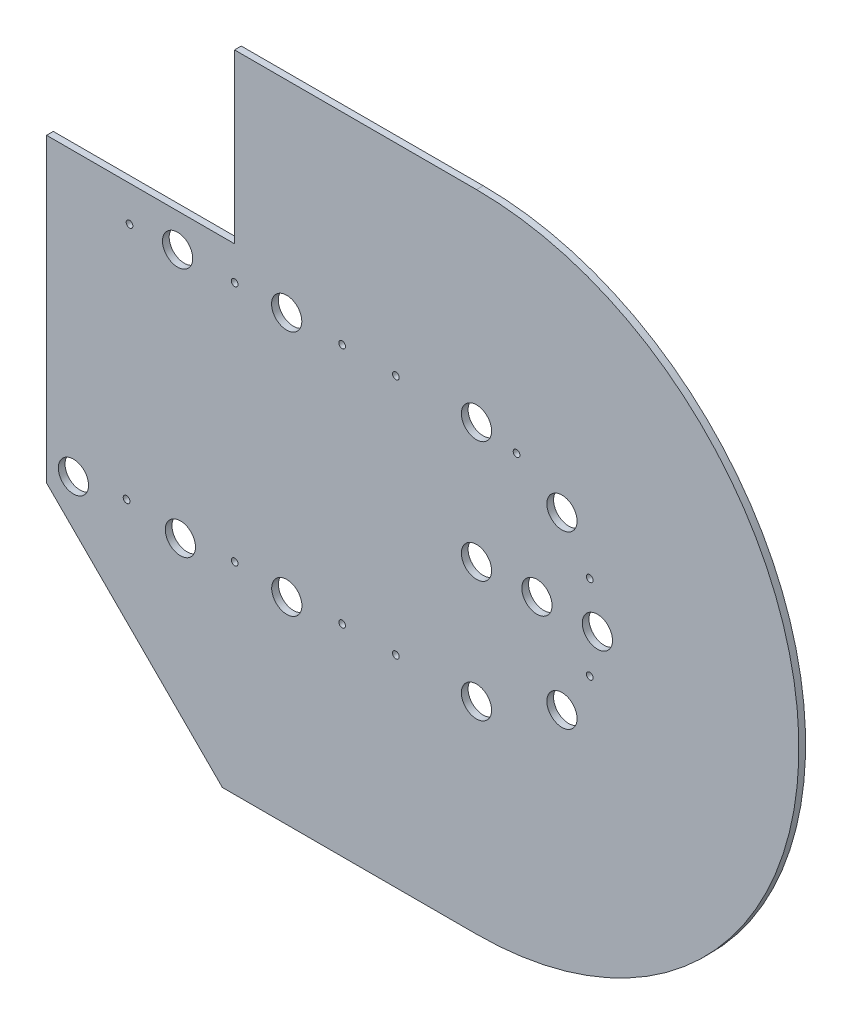
ISO-10303-21;
HEADER;
FILE_DESCRIPTION(('STEP AP214'),'2;1');
FILE_NAME('part.step','',(''),(''),'','','');
FILE_SCHEMA(('AUTOMOTIVE_DESIGN { 1 0 10303 214 1 1 1 1 }'));
ENDSEC;
DATA;
#1=APPLICATION_CONTEXT('core data for automotive mechanical design processes');
#2=APPLICATION_PROTOCOL_DEFINITION('international standard','automotive_design',2000,#1);
#3=PRODUCT_CONTEXT('',#1,'mechanical');
#4=PRODUCT('Part','Part','',(#3));
#5=PRODUCT_RELATED_PRODUCT_CATEGORY('part','',(#4));
#6=PRODUCT_DEFINITION_FORMATION('','',#4);
#7=PRODUCT_DEFINITION_CONTEXT('part definition',#1,'design');
#8=PRODUCT_DEFINITION('design','',#6,#7);
#9=PRODUCT_DEFINITION_SHAPE('','',#8);
#10=(LENGTH_UNIT() NAMED_UNIT(*) SI_UNIT(.MILLI.,.METRE.));
#11=(NAMED_UNIT(*) PLANE_ANGLE_UNIT() SI_UNIT($,.RADIAN.));
#12=(NAMED_UNIT(*) SI_UNIT($,.STERADIAN.) SOLID_ANGLE_UNIT());
#13=UNCERTAINTY_MEASURE_WITH_UNIT(LENGTH_MEASURE(1.E-05),#10,'distance_accuracy_value','');
#14=(GEOMETRIC_REPRESENTATION_CONTEXT(3) GLOBAL_UNCERTAINTY_ASSIGNED_CONTEXT((#13)) GLOBAL_UNIT_ASSIGNED_CONTEXT((#10,
#11,#12)) REPRESENTATION_CONTEXT('',''));
#15=CARTESIAN_POINT('',(0.,0.,0.));
#16=DIRECTION('',(0.,0.,1.));
#17=DIRECTION('',(1.,0.,0.));
#18=AXIS2_PLACEMENT_3D('',#15,#16,#17);
#19=CARTESIAN_POINT('',(0.,0.,6.35));
#20=DIRECTION('',(0.,0.,1.));
#21=DIRECTION('',(1.,0.,0.));
#22=AXIS2_PLACEMENT_3D('',#19,#20,#21);
#23=PLANE('',#22);
#24=DIRECTION('',(0.,1.,0.));
#25=VECTOR('',#24,1.);
#26=CARTESIAN_POINT('',(-228.717773435976,304.8,6.35));
#27=LINE('',#26,#25);
#28=CARTESIAN_POINT('',(-228.717773435976,146.05,6.35));
#29=VERTEX_POINT('',#28);
#30=CARTESIAN_POINT('',(-228.717773435976,304.8,6.35));
#31=VERTEX_POINT('',#30);
#32=EDGE_CURVE('E130',#29,#31,#27,.T.);
#33=ORIENTED_EDGE('',*,*,#32,.F.);
#34=DIRECTION('',(1.,0.,0.));
#35=VECTOR('',#34,1.);
#36=CARTESIAN_POINT('',(-406.4,146.05,6.35));
#37=LINE('',#36,#35);
#38=CARTESIAN_POINT('',(-406.4,146.05,6.35));
#39=VERTEX_POINT('',#38);
#40=EDGE_CURVE('E110',#39,#29,#37,.T.);
#41=ORIENTED_EDGE('',*,*,#40,.F.);
#42=DIRECTION('',(0.,-1.,0.));
#43=VECTOR('',#42,1.);
#44=CARTESIAN_POINT('',(-406.4,-120.65,6.35));
#45=LINE('',#44,#43);
#46=CARTESIAN_POINT('',(-406.4,-138.610512242138,6.35));
#47=VERTEX_POINT('',#46);
#48=EDGE_CURVE('E331',#39,#47,#45,.T.);
#49=ORIENTED_EDGE('',*,*,#48,.T.);
#50=DIRECTION('',(0.707106781186548,-0.707106781186547,0.));
#51=VECTOR('',#50,1.);
#52=CARTESIAN_POINT('',(-406.4,-138.610512242138,6.35));
#53=LINE('',#52,#51);
#54=CARTESIAN_POINT('',(-240.210512242138,-304.8,6.35));
#55=VERTEX_POINT('',#54);
#56=EDGE_CURVE('E334',#47,#55,#53,.T.);
#57=ORIENTED_EDGE('',*,*,#56,.T.);
#58=DIRECTION('',(1.,0.,0.));
#59=VECTOR('',#58,1.);
#60=CARTESIAN_POINT('',(-240.210512242138,-304.8,6.35));
#61=LINE('',#60,#59);
#62=CARTESIAN_POINT('',(0.,-304.8,6.35));
#63=VERTEX_POINT('',#62);
#64=EDGE_CURVE('E64',#55,#63,#61,.T.);
#65=ORIENTED_EDGE('',*,*,#64,.T.);
#66=CARTESIAN_POINT('',(0.,0.,6.35));
#67=DIRECTION('',(0.,0.,1.));
#68=DIRECTION('',(1.,0.,0.));
#69=AXIS2_PLACEMENT_3D('',#66,#67,#68);
#70=CIRCLE('',#69,304.8);
#71=CARTESIAN_POINT('',(0.,304.8,6.35));
#72=VERTEX_POINT('',#71);
#73=EDGE_CURVE('E326',#63,#72,#70,.T.);
#74=ORIENTED_EDGE('',*,*,#73,.T.);
#75=DIRECTION('',(-1.,0.,0.));
#76=VECTOR('',#75,1.);
#77=CARTESIAN_POINT('',(0.,304.8,6.35));
#78=LINE('',#77,#76);
#79=EDGE_CURVE('E91',#72,#31,#78,.T.);
#80=ORIENTED_EDGE('',*,*,#79,.T.);
#81=EDGE_LOOP('',(#33,#41,#49,#57,#65,#74,#80));
#82=FACE_BOUND('',#81,.T.);
#83=CARTESIAN_POINT('',(-127.,-114.3,6.35));
#84=DIRECTION('',(0.,0.,1.));
#85=DIRECTION('',(1.,0.,0.));
#86=AXIS2_PLACEMENT_3D('',#83,#84,#85);
#87=CIRCLE('',#86,3.175);
#88=CARTESIAN_POINT('',(-123.825,-114.3,6.35));
#89=VERTEX_POINT('',#88);
#90=EDGE_CURVE('E150',#89,#89,#87,.T.);
#91=ORIENTED_EDGE('',*,*,#90,.F.);
#92=EDGE_LOOP('',(#91));
#93=FACE_BOUND('',#92,.T.);
#94=CARTESIAN_POINT('',(-76.2,114.3,6.35));
#95=DIRECTION('',(0.,0.,1.));
#96=DIRECTION('',(1.,0.,0.));
#97=AXIS2_PLACEMENT_3D('',#94,#95,#96);
#98=CIRCLE('',#97,3.175);
#99=CARTESIAN_POINT('',(-73.025,114.3,6.35));
#100=VERTEX_POINT('',#99);
#101=EDGE_CURVE('E166',#100,#100,#98,.T.);
#102=ORIENTED_EDGE('',*,*,#101,.F.);
#103=EDGE_LOOP('',(#102));
#104=FACE_BOUND('',#103,.T.);
#105=CARTESIAN_POINT('',(-228.6,114.3,6.35));
#106=DIRECTION('',(0.,0.,1.));
#107=DIRECTION('',(1.,0.,0.));
#108=AXIS2_PLACEMENT_3D('',#105,#106,#107);
#109=CIRCLE('',#108,3.17500000000001);
#110=CARTESIAN_POINT('',(-225.425,114.3,6.35));
#111=VERTEX_POINT('',#110);
#112=EDGE_CURVE('E182',#111,#111,#109,.T.);
#113=ORIENTED_EDGE('',*,*,#112,.F.);
#114=EDGE_LOOP('',(#113));
#115=FACE_BOUND('',#114,.T.);
#116=CARTESIAN_POINT('',(-327.981609649123,112.531845238095,6.35));
#117=DIRECTION('',(0.,0.,1.));
#118=DIRECTION('',(1.,0.,0.));
#119=AXIS2_PLACEMENT_3D('',#116,#117,#118);
#120=CIRCLE('',#119,3.17499999999998);
#121=CARTESIAN_POINT('',(-324.806609649123,112.531845238095,6.35));
#122=VERTEX_POINT('',#121);
#123=EDGE_CURVE('E198',#122,#122,#120,.T.);
#124=ORIENTED_EDGE('',*,*,#123,.F.);
#125=EDGE_LOOP('',(#124));
#126=FACE_BOUND('',#125,.T.);
#127=CARTESIAN_POINT('',(107.090214294279,39.9521714354231,6.35));
#128=DIRECTION('',(0.,0.,1.));
#129=DIRECTION('',(1.,0.,0.));
#130=AXIS2_PLACEMENT_3D('',#127,#128,#129);
#131=CIRCLE('',#130,3.175);
#132=CARTESIAN_POINT('',(110.265214294279,39.9521714354231,6.35));
#133=VERTEX_POINT('',#132);
#134=EDGE_CURVE('E214',#133,#133,#131,.T.);
#135=ORIENTED_EDGE('',*,*,#134,.F.);
#136=EDGE_LOOP('',(#135));
#137=FACE_BOUND('',#136,.T.);
#138=CARTESIAN_POINT('',(57.15,0.,6.35));
#139=DIRECTION('',(0.,0.,1.));
#140=DIRECTION('',(1.,0.,0.));
#141=AXIS2_PLACEMENT_3D('',#138,#139,#140);
#142=CIRCLE('',#141,14.2875);
#143=CARTESIAN_POINT('',(71.4375,0.,6.35));
#144=VERTEX_POINT('',#143);
#145=EDGE_CURVE('E230',#144,#144,#142,.T.);
#146=ORIENTED_EDGE('',*,*,#145,.F.);
#147=EDGE_LOOP('',(#146));
#148=FACE_BOUND('',#147,.T.);
#149=CARTESIAN_POINT('',(-279.904657874784,-120.65,6.35));
#150=DIRECTION('',(0.,0.,1.));
#151=DIRECTION('',(1.,0.,0.));
#152=AXIS2_PLACEMENT_3D('',#149,#150,#151);
#153=CIRCLE('',#152,14.2875);
#154=CARTESIAN_POINT('',(-265.617157874784,-120.65,6.35));
#155=VERTEX_POINT('',#154);
#156=EDGE_CURVE('E246',#155,#155,#153,.T.);
#157=ORIENTED_EDGE('',*,*,#156,.F.);
#158=EDGE_LOOP('',(#157));
#159=FACE_BOUND('',#158,.T.);
#160=CARTESIAN_POINT('',(-179.316283411286,-118.36802233413,6.35));
#161=DIRECTION('',(0.,0.,1.));
#162=DIRECTION('',(1.,0.,0.));
#163=AXIS2_PLACEMENT_3D('',#160,#161,#162);
#164=CIRCLE('',#163,14.2875);
#165=CARTESIAN_POINT('',(-165.028783411286,-118.36802233413,6.35));
#166=VERTEX_POINT('',#165);
#167=EDGE_CURVE('E262',#166,#166,#164,.T.);
#168=ORIENTED_EDGE('',*,*,#167,.F.);
#169=EDGE_LOOP('',(#168));
#170=FACE_BOUND('',#169,.T.);
#171=CARTESIAN_POINT('',(80.8223050896224,-80.8223050896224,6.35));
#172=DIRECTION('',(0.,0.,1.));
#173=DIRECTION('',(1.,0.,0.));
#174=AXIS2_PLACEMENT_3D('',#171,#172,#173);
#175=CIRCLE('',#174,14.2875);
#176=CARTESIAN_POINT('',(95.1098050896224,-80.8223050896224,6.35));
#177=VERTEX_POINT('',#176);
#178=EDGE_CURVE('E278',#177,#177,#175,.T.);
#179=ORIENTED_EDGE('',*,*,#178,.F.);
#180=EDGE_LOOP('',(#179));
#181=FACE_BOUND('',#180,.T.);
#182=CARTESIAN_POINT('',(80.8223050896224,80.8223050896224,6.35));
#183=DIRECTION('',(0.,0.,1.));
#184=DIRECTION('',(1.,0.,0.));
#185=AXIS2_PLACEMENT_3D('',#182,#183,#184);
#186=CIRCLE('',#185,14.2875);
#187=CARTESIAN_POINT('',(95.1098050896224,80.8223050896224,6.35));
#188=VERTEX_POINT('',#187);
#189=EDGE_CURVE('E294',#188,#188,#186,.T.);
#190=ORIENTED_EDGE('',*,*,#189,.F.);
#191=EDGE_LOOP('',(#190));
#192=FACE_BOUND('',#191,.T.);
#193=CARTESIAN_POINT('',(-179.408571771251,114.3,6.35));
#194=DIRECTION('',(0.,0.,1.));
#195=DIRECTION('',(1.,0.,0.));
#196=AXIS2_PLACEMENT_3D('',#193,#194,#195);
#197=CIRCLE('',#196,14.2875);
#198=CARTESIAN_POINT('',(-165.121071771251,114.3,6.35));
#199=VERTEX_POINT('',#198);
#200=EDGE_CURVE('E310',#199,#199,#197,.T.);
#201=ORIENTED_EDGE('',*,*,#200,.F.);
#202=EDGE_LOOP('',(#201));
#203=FACE_BOUND('',#202,.T.);
#204=CARTESIAN_POINT('',(-282.557162358345,114.3,6.35));
#205=DIRECTION('',(0.,0.,1.));
#206=DIRECTION('',(1.,0.,0.));
#207=AXIS2_PLACEMENT_3D('',#204,#205,#206);
#208=CIRCLE('',#207,14.2875);
#209=CARTESIAN_POINT('',(-268.269662358345,114.3,6.35));
#210=VERTEX_POINT('',#209);
#211=EDGE_CURVE('E318',#210,#210,#208,.T.);
#212=ORIENTED_EDGE('',*,*,#211,.F.);
#213=EDGE_LOOP('',(#212));
#214=FACE_BOUND('',#213,.T.);
#215=CARTESIAN_POINT('',(0.,114.3,6.35));
#216=DIRECTION('',(0.,0.,1.));
#217=DIRECTION('',(1.,0.,0.));
#218=AXIS2_PLACEMENT_3D('',#215,#216,#217);
#219=CIRCLE('',#218,14.2875);
#220=CARTESIAN_POINT('',(14.2875,114.3,6.35));
#221=VERTEX_POINT('',#220);
#222=EDGE_CURVE('E302',#221,#221,#219,.T.);
#223=ORIENTED_EDGE('',*,*,#222,.F.);
#224=EDGE_LOOP('',(#223));
#225=FACE_BOUND('',#224,.T.);
#226=CARTESIAN_POINT('',(114.3,0.,6.35));
#227=DIRECTION('',(0.,0.,1.));
#228=DIRECTION('',(1.,0.,0.));
#229=AXIS2_PLACEMENT_3D('',#226,#227,#228);
#230=CIRCLE('',#229,14.2875);
#231=CARTESIAN_POINT('',(128.5875,0.,6.35));
#232=VERTEX_POINT('',#231);
#233=EDGE_CURVE('E286',#232,#232,#230,.T.);
#234=ORIENTED_EDGE('',*,*,#233,.F.);
#235=EDGE_LOOP('',(#234));
#236=FACE_BOUND('',#235,.T.);
#237=CARTESIAN_POINT('',(0.,-114.3,6.35));
#238=DIRECTION('',(0.,0.,1.));
#239=DIRECTION('',(1.,0.,0.));
#240=AXIS2_PLACEMENT_3D('',#237,#238,#239);
#241=CIRCLE('',#240,14.2875);
#242=CARTESIAN_POINT('',(14.2875,-114.3,6.35));
#243=VERTEX_POINT('',#242);
#244=EDGE_CURVE('E270',#243,#243,#241,.T.);
#245=ORIENTED_EDGE('',*,*,#244,.F.);
#246=EDGE_LOOP('',(#245));
#247=FACE_BOUND('',#246,.T.);
#248=CARTESIAN_POINT('',(-381.,-120.65,6.35));
#249=DIRECTION('',(0.,0.,1.));
#250=DIRECTION('',(1.,0.,0.));
#251=AXIS2_PLACEMENT_3D('',#248,#249,#250);
#252=CIRCLE('',#251,14.2875);
#253=CARTESIAN_POINT('',(-366.7125,-120.65,6.35));
#254=VERTEX_POINT('',#253);
#255=EDGE_CURVE('E254',#254,#254,#252,.T.);
#256=ORIENTED_EDGE('',*,*,#255,.F.);
#257=EDGE_LOOP('',(#256));
#258=FACE_BOUND('',#257,.T.);
#259=CARTESIAN_POINT('',(0.,0.,6.35));
#260=DIRECTION('',(0.,0.,1.));
#261=DIRECTION('',(1.,0.,0.));
#262=AXIS2_PLACEMENT_3D('',#259,#260,#261);
#263=CIRCLE('',#262,14.2875);
#264=CARTESIAN_POINT('',(14.2875,0.,6.35));
#265=VERTEX_POINT('',#264);
#266=EDGE_CURVE('E238',#265,#265,#263,.T.);
#267=ORIENTED_EDGE('',*,*,#266,.F.);
#268=EDGE_LOOP('',(#267));
#269=FACE_BOUND('',#268,.T.);
#270=CARTESIAN_POINT('',(37.893602923623,107.835823627711,6.35));
#271=DIRECTION('',(0.,0.,1.));
#272=DIRECTION('',(1.,0.,0.));
#273=AXIS2_PLACEMENT_3D('',#270,#271,#272);
#274=CIRCLE('',#273,3.175);
#275=CARTESIAN_POINT('',(41.068602923623,107.835823627711,6.35));
#276=VERTEX_POINT('',#275);
#277=EDGE_CURVE('E222',#276,#276,#274,.T.);
#278=ORIENTED_EDGE('',*,*,#277,.F.);
#279=EDGE_LOOP('',(#278));
#280=FACE_BOUND('',#279,.T.);
#281=CARTESIAN_POINT('',(107.090214294279,-39.9521714354231,6.35));
#282=DIRECTION('',(0.,0.,1.));
#283=DIRECTION('',(1.,0.,0.));
#284=AXIS2_PLACEMENT_3D('',#281,#282,#283);
#285=CIRCLE('',#284,3.175);
#286=CARTESIAN_POINT('',(110.265214294279,-39.9521714354231,6.35));
#287=VERTEX_POINT('',#286);
#288=EDGE_CURVE('E206',#287,#287,#285,.T.);
#289=ORIENTED_EDGE('',*,*,#288,.F.);
#290=EDGE_LOOP('',(#289));
#291=FACE_BOUND('',#290,.T.);
#292=CARTESIAN_POINT('',(-330.785746455604,-114.289302148429,6.35));
#293=DIRECTION('',(0.,0.,1.));
#294=DIRECTION('',(1.,0.,0.));
#295=AXIS2_PLACEMENT_3D('',#292,#293,#294);
#296=CIRCLE('',#295,3.17499999999998);
#297=CARTESIAN_POINT('',(-327.610746455604,-114.289302148429,6.35));
#298=VERTEX_POINT('',#297);
#299=EDGE_CURVE('E190',#298,#298,#296,.T.);
#300=ORIENTED_EDGE('',*,*,#299,.F.);
#301=EDGE_LOOP('',(#300));
#302=FACE_BOUND('',#301,.T.);
#303=CARTESIAN_POINT('',(-127.,114.3,6.35));
#304=DIRECTION('',(0.,0.,1.));
#305=DIRECTION('',(1.,0.,0.));
#306=AXIS2_PLACEMENT_3D('',#303,#304,#305);
#307=CIRCLE('',#306,3.175);
#308=CARTESIAN_POINT('',(-123.825,114.3,6.35));
#309=VERTEX_POINT('',#308);
#310=EDGE_CURVE('E174',#309,#309,#307,.T.);
#311=ORIENTED_EDGE('',*,*,#310,.F.);
#312=EDGE_LOOP('',(#311));
#313=FACE_BOUND('',#312,.T.);
#314=CARTESIAN_POINT('',(-76.2,-114.3,6.35));
#315=DIRECTION('',(0.,0.,1.));
#316=DIRECTION('',(1.,0.,0.));
#317=AXIS2_PLACEMENT_3D('',#314,#315,#316);
#318=CIRCLE('',#317,3.175);
#319=CARTESIAN_POINT('',(-73.025,-114.3,6.35));
#320=VERTEX_POINT('',#319);
#321=EDGE_CURVE('E158',#320,#320,#318,.T.);
#322=ORIENTED_EDGE('',*,*,#321,.F.);
#323=EDGE_LOOP('',(#322));
#324=FACE_BOUND('',#323,.T.);
#325=CARTESIAN_POINT('',(-228.6,-114.3,6.35));
#326=DIRECTION('',(0.,0.,1.));
#327=DIRECTION('',(1.,0.,0.));
#328=AXIS2_PLACEMENT_3D('',#325,#326,#327);
#329=CIRCLE('',#328,3.17500000000001);
#330=CARTESIAN_POINT('',(-225.425,-114.3,6.35));
#331=VERTEX_POINT('',#330);
#332=EDGE_CURVE('E142',#331,#331,#329,.T.);
#333=ORIENTED_EDGE('',*,*,#332,.F.);
#334=EDGE_LOOP('',(#333));
#335=FACE_BOUND('',#334,.T.);
#336=ADVANCED_FACE('F39',(#82,#93,#104,#115,#126,#137,#148,#159,#170,#181,#192,#203,#214,#225,
#236,#247,#258,#269,#280,#291,#302,#313,#324,#335),#23,.T.);
#337=CARTESIAN_POINT('',(0.,0.,0.));
#338=DIRECTION('',(0.,0.,1.));
#339=DIRECTION('',(1.,0.,0.));
#340=AXIS2_PLACEMENT_3D('',#337,#338,#339);
#341=PLANE('',#340);
#342=DIRECTION('',(1.,0.,0.));
#343=VECTOR('',#342,1.);
#344=CARTESIAN_POINT('',(-406.4,146.05,0.));
#345=LINE('',#344,#343);
#346=CARTESIAN_POINT('',(-406.4,146.05,0.));
#347=VERTEX_POINT('',#346);
#348=CARTESIAN_POINT('',(-228.717773435976,146.05,0.));
#349=VERTEX_POINT('',#348);
#350=EDGE_CURVE('E55',#347,#349,#345,.T.);
#351=ORIENTED_EDGE('',*,*,#350,.T.);
#352=DIRECTION('',(0.,1.,0.));
#353=VECTOR('',#352,1.);
#354=CARTESIAN_POINT('',(-228.717773435976,304.8,0.));
#355=LINE('',#354,#353);
#356=CARTESIAN_POINT('',(-228.717773435976,304.8,0.));
#357=VERTEX_POINT('',#356);
#358=EDGE_CURVE('E118',#349,#357,#355,.T.);
#359=ORIENTED_EDGE('',*,*,#358,.T.);
#360=DIRECTION('',(-1.,0.,0.));
#361=VECTOR('',#360,1.);
#362=CARTESIAN_POINT('',(0.,304.8,0.));
#363=LINE('',#362,#361);
#364=CARTESIAN_POINT('',(0.,304.8,0.));
#365=VERTEX_POINT('',#364);
#366=EDGE_CURVE('E343',#365,#357,#363,.T.);
#367=ORIENTED_EDGE('',*,*,#366,.F.);
#368=CARTESIAN_POINT('',(0.,0.,0.));
#369=DIRECTION('',(0.,0.,1.));
#370=DIRECTION('',(1.,0.,0.));
#371=AXIS2_PLACEMENT_3D('',#368,#369,#370);
#372=CIRCLE('',#371,304.8);
#373=CARTESIAN_POINT('',(0.,-304.8,0.));
#374=VERTEX_POINT('',#373);
#375=EDGE_CURVE('E322',#374,#365,#372,.T.);
#376=ORIENTED_EDGE('',*,*,#375,.F.);
#377=DIRECTION('',(1.,0.,0.));
#378=VECTOR('',#377,1.);
#379=CARTESIAN_POINT('',(-222.25,-304.8,0.));
#380=LINE('',#379,#378);
#381=CARTESIAN_POINT('',(-240.210512242138,-304.8,0.));
#382=VERTEX_POINT('',#381);
#383=EDGE_CURVE('E84',#382,#374,#380,.T.);
#384=ORIENTED_EDGE('',*,*,#383,.F.);
#385=DIRECTION('',(0.707106781186548,-0.707106781186547,0.));
#386=VECTOR('',#385,1.);
#387=CARTESIAN_POINT('',(-406.4,-138.610512242138,0.));
#388=LINE('',#387,#386);
#389=CARTESIAN_POINT('',(-406.4,-138.610512242138,0.));
#390=VERTEX_POINT('',#389);
#391=EDGE_CURVE('E348',#390,#382,#388,.T.);
#392=ORIENTED_EDGE('',*,*,#391,.F.);
#393=DIRECTION('',(0.,-1.,0.));
#394=VECTOR('',#393,1.);
#395=CARTESIAN_POINT('',(-406.4,-120.65,0.));
#396=LINE('',#395,#394);
#397=EDGE_CURVE('E128',#347,#390,#396,.T.);
#398=ORIENTED_EDGE('',*,*,#397,.F.);
#399=EDGE_LOOP('',(#351,#359,#367,#376,#384,#392,#398));
#400=FACE_BOUND('',#399,.T.);
#401=CARTESIAN_POINT('',(-282.557162358345,114.3,0.));
#402=DIRECTION('',(0.,0.,1.));
#403=DIRECTION('',(1.,0.,0.));
#404=AXIS2_PLACEMENT_3D('',#401,#402,#403);
#405=CIRCLE('',#404,14.2875);
#406=CARTESIAN_POINT('',(-268.269662358345,114.3,0.));
#407=VERTEX_POINT('',#406);
#408=EDGE_CURVE('E314',#407,#407,#405,.T.);
#409=ORIENTED_EDGE('',*,*,#408,.T.);
#410=EDGE_LOOP('',(#409));
#411=FACE_BOUND('',#410,.T.);
#412=CARTESIAN_POINT('',(-179.408571771251,114.3,0.));
#413=DIRECTION('',(0.,0.,1.));
#414=DIRECTION('',(1.,0.,0.));
#415=AXIS2_PLACEMENT_3D('',#412,#413,#414);
#416=CIRCLE('',#415,14.2875);
#417=CARTESIAN_POINT('',(-165.121071771251,114.3,0.));
#418=VERTEX_POINT('',#417);
#419=EDGE_CURVE('E306',#418,#418,#416,.T.);
#420=ORIENTED_EDGE('',*,*,#419,.T.);
#421=EDGE_LOOP('',(#420));
#422=FACE_BOUND('',#421,.T.);
#423=CARTESIAN_POINT('',(0.,114.3,0.));
#424=DIRECTION('',(0.,0.,1.));
#425=DIRECTION('',(1.,0.,0.));
#426=AXIS2_PLACEMENT_3D('',#423,#424,#425);
#427=CIRCLE('',#426,14.2875);
#428=CARTESIAN_POINT('',(14.2875,114.3,0.));
#429=VERTEX_POINT('',#428);
#430=EDGE_CURVE('E298',#429,#429,#427,.T.);
#431=ORIENTED_EDGE('',*,*,#430,.T.);
#432=EDGE_LOOP('',(#431));
#433=FACE_BOUND('',#432,.T.);
#434=CARTESIAN_POINT('',(80.8223050896224,80.8223050896224,0.));
#435=DIRECTION('',(0.,0.,1.));
#436=DIRECTION('',(1.,0.,0.));
#437=AXIS2_PLACEMENT_3D('',#434,#435,#436);
#438=CIRCLE('',#437,14.2875);
#439=CARTESIAN_POINT('',(95.1098050896224,80.8223050896224,0.));
#440=VERTEX_POINT('',#439);
#441=EDGE_CURVE('E290',#440,#440,#438,.T.);
#442=ORIENTED_EDGE('',*,*,#441,.T.);
#443=EDGE_LOOP('',(#442));
#444=FACE_BOUND('',#443,.T.);
#445=CARTESIAN_POINT('',(114.3,0.,0.));
#446=DIRECTION('',(0.,0.,1.));
#447=DIRECTION('',(1.,0.,0.));
#448=AXIS2_PLACEMENT_3D('',#445,#446,#447);
#449=CIRCLE('',#448,14.2875);
#450=CARTESIAN_POINT('',(128.5875,0.,0.));
#451=VERTEX_POINT('',#450);
#452=EDGE_CURVE('E282',#451,#451,#449,.T.);
#453=ORIENTED_EDGE('',*,*,#452,.T.);
#454=EDGE_LOOP('',(#453));
#455=FACE_BOUND('',#454,.T.);
#456=CARTESIAN_POINT('',(80.8223050896224,-80.8223050896224,0.));
#457=DIRECTION('',(0.,0.,1.));
#458=DIRECTION('',(1.,0.,0.));
#459=AXIS2_PLACEMENT_3D('',#456,#457,#458);
#460=CIRCLE('',#459,14.2875);
#461=CARTESIAN_POINT('',(95.1098050896224,-80.8223050896224,0.));
#462=VERTEX_POINT('',#461);
#463=EDGE_CURVE('E274',#462,#462,#460,.T.);
#464=ORIENTED_EDGE('',*,*,#463,.T.);
#465=EDGE_LOOP('',(#464));
#466=FACE_BOUND('',#465,.T.);
#467=CARTESIAN_POINT('',(0.,-114.3,0.));
#468=DIRECTION('',(0.,0.,1.));
#469=DIRECTION('',(1.,0.,0.));
#470=AXIS2_PLACEMENT_3D('',#467,#468,#469);
#471=CIRCLE('',#470,14.2875);
#472=CARTESIAN_POINT('',(14.2875,-114.3,0.));
#473=VERTEX_POINT('',#472);
#474=EDGE_CURVE('E266',#473,#473,#471,.T.);
#475=ORIENTED_EDGE('',*,*,#474,.T.);
#476=EDGE_LOOP('',(#475));
#477=FACE_BOUND('',#476,.T.);
#478=CARTESIAN_POINT('',(-179.316283411286,-118.36802233413,0.));
#479=DIRECTION('',(0.,0.,1.));
#480=DIRECTION('',(1.,0.,0.));
#481=AXIS2_PLACEMENT_3D('',#478,#479,#480);
#482=CIRCLE('',#481,14.2875);
#483=CARTESIAN_POINT('',(-165.028783411286,-118.36802233413,0.));
#484=VERTEX_POINT('',#483);
#485=EDGE_CURVE('E258',#484,#484,#482,.T.);
#486=ORIENTED_EDGE('',*,*,#485,.T.);
#487=EDGE_LOOP('',(#486));
#488=FACE_BOUND('',#487,.T.);
#489=CARTESIAN_POINT('',(-381.,-120.65,0.));
#490=DIRECTION('',(0.,0.,1.));
#491=DIRECTION('',(1.,0.,0.));
#492=AXIS2_PLACEMENT_3D('',#489,#490,#491);
#493=CIRCLE('',#492,14.2875);
#494=CARTESIAN_POINT('',(-366.7125,-120.65,0.));
#495=VERTEX_POINT('',#494);
#496=EDGE_CURVE('E250',#495,#495,#493,.T.);
#497=ORIENTED_EDGE('',*,*,#496,.T.);
#498=EDGE_LOOP('',(#497));
#499=FACE_BOUND('',#498,.T.);
#500=CARTESIAN_POINT('',(-279.904657874784,-120.65,0.));
#501=DIRECTION('',(0.,0.,1.));
#502=DIRECTION('',(1.,0.,0.));
#503=AXIS2_PLACEMENT_3D('',#500,#501,#502);
#504=CIRCLE('',#503,14.2875);
#505=CARTESIAN_POINT('',(-265.617157874784,-120.65,0.));
#506=VERTEX_POINT('',#505);
#507=EDGE_CURVE('E242',#506,#506,#504,.T.);
#508=ORIENTED_EDGE('',*,*,#507,.T.);
#509=EDGE_LOOP('',(#508));
#510=FACE_BOUND('',#509,.T.);
#511=CARTESIAN_POINT('',(0.,0.,0.));
#512=DIRECTION('',(0.,0.,1.));
#513=DIRECTION('',(1.,0.,0.));
#514=AXIS2_PLACEMENT_3D('',#511,#512,#513);
#515=CIRCLE('',#514,14.2875);
#516=CARTESIAN_POINT('',(14.2875,0.,0.));
#517=VERTEX_POINT('',#516);
#518=EDGE_CURVE('E234',#517,#517,#515,.T.);
#519=ORIENTED_EDGE('',*,*,#518,.T.);
#520=EDGE_LOOP('',(#519));
#521=FACE_BOUND('',#520,.T.);
#522=CARTESIAN_POINT('',(57.15,0.,0.));
#523=DIRECTION('',(0.,0.,1.));
#524=DIRECTION('',(1.,0.,0.));
#525=AXIS2_PLACEMENT_3D('',#522,#523,#524);
#526=CIRCLE('',#525,14.2875);
#527=CARTESIAN_POINT('',(71.4375,0.,0.));
#528=VERTEX_POINT('',#527);
#529=EDGE_CURVE('E226',#528,#528,#526,.T.);
#530=ORIENTED_EDGE('',*,*,#529,.T.);
#531=EDGE_LOOP('',(#530));
#532=FACE_BOUND('',#531,.T.);
#533=CARTESIAN_POINT('',(37.893602923623,107.835823627711,0.));
#534=DIRECTION('',(0.,0.,1.));
#535=DIRECTION('',(1.,0.,0.));
#536=AXIS2_PLACEMENT_3D('',#533,#534,#535);
#537=CIRCLE('',#536,3.175);
#538=CARTESIAN_POINT('',(41.068602923623,107.835823627711,0.));
#539=VERTEX_POINT('',#538);
#540=EDGE_CURVE('E218',#539,#539,#537,.T.);
#541=ORIENTED_EDGE('',*,*,#540,.T.);
#542=EDGE_LOOP('',(#541));
#543=FACE_BOUND('',#542,.T.);
#544=CARTESIAN_POINT('',(107.090214294279,39.9521714354231,0.));
#545=DIRECTION('',(0.,0.,1.));
#546=DIRECTION('',(1.,0.,0.));
#547=AXIS2_PLACEMENT_3D('',#544,#545,#546);
#548=CIRCLE('',#547,3.175);
#549=CARTESIAN_POINT('',(110.265214294279,39.9521714354231,0.));
#550=VERTEX_POINT('',#549);
#551=EDGE_CURVE('E210',#550,#550,#548,.T.);
#552=ORIENTED_EDGE('',*,*,#551,.T.);
#553=EDGE_LOOP('',(#552));
#554=FACE_BOUND('',#553,.T.);
#555=CARTESIAN_POINT('',(107.090214294279,-39.9521714354231,0.));
#556=DIRECTION('',(0.,0.,1.));
#557=DIRECTION('',(1.,0.,0.));
#558=AXIS2_PLACEMENT_3D('',#555,#556,#557);
#559=CIRCLE('',#558,3.175);
#560=CARTESIAN_POINT('',(110.265214294279,-39.9521714354231,0.));
#561=VERTEX_POINT('',#560);
#562=EDGE_CURVE('E202',#561,#561,#559,.T.);
#563=ORIENTED_EDGE('',*,*,#562,.T.);
#564=EDGE_LOOP('',(#563));
#565=FACE_BOUND('',#564,.T.);
#566=CARTESIAN_POINT('',(-327.981609649123,112.531845238095,0.));
#567=DIRECTION('',(0.,0.,1.));
#568=DIRECTION('',(1.,0.,0.));
#569=AXIS2_PLACEMENT_3D('',#566,#567,#568);
#570=CIRCLE('',#569,3.17499999999998);
#571=CARTESIAN_POINT('',(-324.806609649123,112.531845238095,0.));
#572=VERTEX_POINT('',#571);
#573=EDGE_CURVE('E194',#572,#572,#570,.T.);
#574=ORIENTED_EDGE('',*,*,#573,.T.);
#575=EDGE_LOOP('',(#574));
#576=FACE_BOUND('',#575,.T.);
#577=CARTESIAN_POINT('',(-330.785746455604,-114.289302148429,0.));
#578=DIRECTION('',(0.,0.,1.));
#579=DIRECTION('',(1.,0.,0.));
#580=AXIS2_PLACEMENT_3D('',#577,#578,#579);
#581=CIRCLE('',#580,3.17499999999998);
#582=CARTESIAN_POINT('',(-327.610746455604,-114.289302148429,0.));
#583=VERTEX_POINT('',#582);
#584=EDGE_CURVE('E186',#583,#583,#581,.T.);
#585=ORIENTED_EDGE('',*,*,#584,.T.);
#586=EDGE_LOOP('',(#585));
#587=FACE_BOUND('',#586,.T.);
#588=CARTESIAN_POINT('',(-228.6,114.3,0.));
#589=DIRECTION('',(0.,0.,1.));
#590=DIRECTION('',(1.,0.,0.));
#591=AXIS2_PLACEMENT_3D('',#588,#589,#590);
#592=CIRCLE('',#591,3.17500000000001);
#593=CARTESIAN_POINT('',(-225.425,114.3,0.));
#594=VERTEX_POINT('',#593);
#595=EDGE_CURVE('E178',#594,#594,#592,.T.);
#596=ORIENTED_EDGE('',*,*,#595,.T.);
#597=EDGE_LOOP('',(#596));
#598=FACE_BOUND('',#597,.T.);
#599=CARTESIAN_POINT('',(-127.,114.3,0.));
#600=DIRECTION('',(0.,0.,1.));
#601=DIRECTION('',(1.,0.,0.));
#602=AXIS2_PLACEMENT_3D('',#599,#600,#601);
#603=CIRCLE('',#602,3.175);
#604=CARTESIAN_POINT('',(-123.825,114.3,0.));
#605=VERTEX_POINT('',#604);
#606=EDGE_CURVE('E170',#605,#605,#603,.T.);
#607=ORIENTED_EDGE('',*,*,#606,.T.);
#608=EDGE_LOOP('',(#607));
#609=FACE_BOUND('',#608,.T.);
#610=CARTESIAN_POINT('',(-76.2,114.3,0.));
#611=DIRECTION('',(0.,0.,1.));
#612=DIRECTION('',(1.,0.,0.));
#613=AXIS2_PLACEMENT_3D('',#610,#611,#612);
#614=CIRCLE('',#613,3.175);
#615=CARTESIAN_POINT('',(-73.025,114.3,0.));
#616=VERTEX_POINT('',#615);
#617=EDGE_CURVE('E162',#616,#616,#614,.T.);
#618=ORIENTED_EDGE('',*,*,#617,.T.);
#619=EDGE_LOOP('',(#618));
#620=FACE_BOUND('',#619,.T.);
#621=CARTESIAN_POINT('',(-76.2,-114.3,0.));
#622=DIRECTION('',(0.,0.,1.));
#623=DIRECTION('',(1.,0.,0.));
#624=AXIS2_PLACEMENT_3D('',#621,#622,#623);
#625=CIRCLE('',#624,3.175);
#626=CARTESIAN_POINT('',(-73.025,-114.3,0.));
#627=VERTEX_POINT('',#626);
#628=EDGE_CURVE('E154',#627,#627,#625,.T.);
#629=ORIENTED_EDGE('',*,*,#628,.T.);
#630=EDGE_LOOP('',(#629));
#631=FACE_BOUND('',#630,.T.);
#632=CARTESIAN_POINT('',(-127.,-114.3,0.));
#633=DIRECTION('',(0.,0.,1.));
#634=DIRECTION('',(1.,0.,0.));
#635=AXIS2_PLACEMENT_3D('',#632,#633,#634);
#636=CIRCLE('',#635,3.175);
#637=CARTESIAN_POINT('',(-123.825,-114.3,0.));
#638=VERTEX_POINT('',#637);
#639=EDGE_CURVE('E146',#638,#638,#636,.T.);
#640=ORIENTED_EDGE('',*,*,#639,.T.);
#641=EDGE_LOOP('',(#640));
#642=FACE_BOUND('',#641,.T.);
#643=CARTESIAN_POINT('',(-228.6,-114.3,0.));
#644=DIRECTION('',(0.,0.,1.));
#645=DIRECTION('',(1.,0.,0.));
#646=AXIS2_PLACEMENT_3D('',#643,#644,#645);
#647=CIRCLE('',#646,3.17500000000001);
#648=CARTESIAN_POINT('',(-225.425,-114.3,0.));
#649=VERTEX_POINT('',#648);
#650=EDGE_CURVE('E138',#649,#649,#647,.T.);
#651=ORIENTED_EDGE('',*,*,#650,.T.);
#652=EDGE_LOOP('',(#651));
#653=FACE_BOUND('',#652,.T.);
#654=ADVANCED_FACE('F125',(#400,#411,#422,#433,#444,#455,#466,#477,#488,#499,#510,#521,#532,
#543,#554,#565,#576,#587,#598,#609,#620,#631,#642,#653),#341,.F.);
#655=CARTESIAN_POINT('',(0.,0.,6.35));
#656=DIRECTION('',(0.,0.,-1.));
#657=DIRECTION('',(-1.,0.,0.));
#658=AXIS2_PLACEMENT_3D('',#655,#656,#657);
#659=CYLINDRICAL_SURFACE('',#658,304.8);
#660=ORIENTED_EDGE('',*,*,#375,.T.);
#661=DIRECTION('',(0.,0.,-1.));
#662=VECTOR('',#661,1.);
#663=CARTESIAN_POINT('',(0.,304.8,6.35));
#664=LINE('',#663,#662);
#665=EDGE_CURVE('E11',#72,#365,#664,.T.);
#666=ORIENTED_EDGE('',*,*,#665,.F.);
#667=ORIENTED_EDGE('',*,*,#73,.F.);
#668=DIRECTION('',(0.,0.,-1.));
#669=VECTOR('',#668,1.);
#670=CARTESIAN_POINT('',(0.,-304.8,6.35));
#671=LINE('',#670,#669);
#672=EDGE_CURVE('E339',#63,#374,#671,.T.);
#673=ORIENTED_EDGE('',*,*,#672,.T.);
#674=EDGE_LOOP('',(#660,#666,#667,#673));
#675=FACE_BOUND('',#674,.T.);
#676=ADVANCED_FACE('F41',(#675),#659,.T.);
#677=CARTESIAN_POINT('',(0.,304.8,6.35));
#678=DIRECTION('',(0.,-1.,0.));
#679=DIRECTION('',(0.,0.,-1.));
#680=AXIS2_PLACEMENT_3D('',#677,#678,#679);
#681=PLANE('',#680);
#682=ORIENTED_EDGE('',*,*,#366,.T.);
#683=DIRECTION('',(0.,0.,1.));
#684=VECTOR('',#683,1.);
#685=CARTESIAN_POINT('',(-228.717773435976,304.8,0.));
#686=LINE('',#685,#684);
#687=EDGE_CURVE('E114',#357,#31,#686,.T.);
#688=ORIENTED_EDGE('',*,*,#687,.T.);
#689=ORIENTED_EDGE('',*,*,#79,.F.);
#690=ORIENTED_EDGE('',*,*,#665,.T.);
#691=EDGE_LOOP('',(#682,#688,#689,#690));
#692=FACE_BOUND('',#691,.T.);
#693=ADVANCED_FACE('F630',(#692),#681,.F.);
#694=CARTESIAN_POINT('',(-406.4,-120.65,6.35));
#695=DIRECTION('',(1.,0.,0.));
#696=DIRECTION('',(0.,0.,-1.));
#697=AXIS2_PLACEMENT_3D('',#694,#695,#696);
#698=PLANE('',#697);
#699=ORIENTED_EDGE('',*,*,#48,.F.);
#700=DIRECTION('',(0.,0.,1.));
#701=VECTOR('',#700,1.);
#702=CARTESIAN_POINT('',(-406.4,146.05,0.));
#703=LINE('',#702,#701);
#704=EDGE_CURVE('E115',#347,#39,#703,.T.);
#705=ORIENTED_EDGE('',*,*,#704,.F.);
#706=ORIENTED_EDGE('',*,*,#397,.T.);
#707=DIRECTION('',(0.,0.,-1.));
#708=VECTOR('',#707,1.);
#709=CARTESIAN_POINT('',(-406.4,-138.610512242138,6.35));
#710=LINE('',#709,#708);
#711=EDGE_CURVE('E48',#47,#390,#710,.T.);
#712=ORIENTED_EDGE('',*,*,#711,.F.);
#713=EDGE_LOOP('',(#699,#705,#706,#712));
#714=FACE_BOUND('',#713,.T.);
#715=ADVANCED_FACE('F382',(#714),#698,.F.);
#716=CARTESIAN_POINT('',(-406.4,-138.610512242138,6.35));
#717=DIRECTION('',(0.707106781186547,0.707106781186548,0.));
#718=DIRECTION('',(-0.707106781186548,0.707106781186547,0.));
#719=AXIS2_PLACEMENT_3D('',#716,#717,#718);
#720=PLANE('',#719);
#721=ORIENTED_EDGE('',*,*,#391,.T.);
#722=DIRECTION('',(0.,0.,-1.));
#723=VECTOR('',#722,1.);
#724=CARTESIAN_POINT('',(-240.210512242138,-304.8,6.35));
#725=LINE('',#724,#723);
#726=EDGE_CURVE('E356',#55,#382,#725,.T.);
#727=ORIENTED_EDGE('',*,*,#726,.F.);
#728=ORIENTED_EDGE('',*,*,#56,.F.);
#729=ORIENTED_EDGE('',*,*,#711,.T.);
#730=EDGE_LOOP('',(#721,#727,#728,#729));
#731=FACE_BOUND('',#730,.T.);
#732=ADVANCED_FACE('F363',(#731),#720,.F.);
#733=CARTESIAN_POINT('',(-222.25,-304.8,6.35));
#734=DIRECTION('',(0.,1.,0.));
#735=DIRECTION('',(0.,0.,1.));
#736=AXIS2_PLACEMENT_3D('',#733,#734,#735);
#737=PLANE('',#736);
#738=ORIENTED_EDGE('',*,*,#383,.T.);
#739=ORIENTED_EDGE('',*,*,#672,.F.);
#740=ORIENTED_EDGE('',*,*,#64,.F.);
#741=ORIENTED_EDGE('',*,*,#726,.T.);
#742=EDGE_LOOP('',(#738,#739,#740,#741));
#743=FACE_BOUND('',#742,.T.);
#744=ADVANCED_FACE('F371',(#743),#737,.F.);
#745=CARTESIAN_POINT('',(-282.557162358345,114.3,6.35));
#746=DIRECTION('',(0.,0.,-1.));
#747=DIRECTION('',(-1.,0.,0.));
#748=AXIS2_PLACEMENT_3D('',#745,#746,#747);
#749=CYLINDRICAL_SURFACE('',#748,14.2875);
#750=ORIENTED_EDGE('',*,*,#211,.T.);
#751=EDGE_LOOP('',(#750));
#752=FACE_BOUND('',#751,.T.);
#753=ORIENTED_EDGE('',*,*,#408,.F.);
#754=EDGE_LOOP('',(#753));
#755=FACE_BOUND('',#754,.T.);
#756=ADVANCED_FACE('F373',(#752,#755),#749,.F.);
#757=CARTESIAN_POINT('',(-179.408571771251,114.3,6.35));
#758=DIRECTION('',(0.,0.,-1.));
#759=DIRECTION('',(-1.,0.,0.));
#760=AXIS2_PLACEMENT_3D('',#757,#758,#759);
#761=CYLINDRICAL_SURFACE('',#760,14.2875);
#762=ORIENTED_EDGE('',*,*,#200,.T.);
#763=EDGE_LOOP('',(#762));
#764=FACE_BOUND('',#763,.T.);
#765=ORIENTED_EDGE('',*,*,#419,.F.);
#766=EDGE_LOOP('',(#765));
#767=FACE_BOUND('',#766,.T.);
#768=ADVANCED_FACE('F379',(#764,#767),#761,.F.);
#769=CARTESIAN_POINT('',(0.,114.3,6.35));
#770=DIRECTION('',(0.,0.,-1.));
#771=DIRECTION('',(-1.,0.,0.));
#772=AXIS2_PLACEMENT_3D('',#769,#770,#771);
#773=CYLINDRICAL_SURFACE('',#772,14.2875);
#774=ORIENTED_EDGE('',*,*,#222,.T.);
#775=EDGE_LOOP('',(#774));
#776=FACE_BOUND('',#775,.T.);
#777=ORIENTED_EDGE('',*,*,#430,.F.);
#778=EDGE_LOOP('',(#777));
#779=FACE_BOUND('',#778,.T.);
#780=ADVANCED_FACE('F395',(#776,#779),#773,.F.);
#781=CARTESIAN_POINT('',(80.8223050896224,80.8223050896224,6.35));
#782=DIRECTION('',(0.,0.,-1.));
#783=DIRECTION('',(-1.,0.,0.));
#784=AXIS2_PLACEMENT_3D('',#781,#782,#783);
#785=CYLINDRICAL_SURFACE('',#784,14.2875);
#786=ORIENTED_EDGE('',*,*,#189,.T.);
#787=EDGE_LOOP('',(#786));
#788=FACE_BOUND('',#787,.T.);
#789=ORIENTED_EDGE('',*,*,#441,.F.);
#790=EDGE_LOOP('',(#789));
#791=FACE_BOUND('',#790,.T.);
#792=ADVANCED_FACE('F399',(#788,#791),#785,.F.);
#793=CARTESIAN_POINT('',(114.3,0.,6.35));
#794=DIRECTION('',(0.,0.,-1.));
#795=DIRECTION('',(-1.,0.,0.));
#796=AXIS2_PLACEMENT_3D('',#793,#794,#795);
#797=CYLINDRICAL_SURFACE('',#796,14.2875);
#798=ORIENTED_EDGE('',*,*,#233,.T.);
#799=EDGE_LOOP('',(#798));
#800=FACE_BOUND('',#799,.T.);
#801=ORIENTED_EDGE('',*,*,#452,.F.);
#802=EDGE_LOOP('',(#801));
#803=FACE_BOUND('',#802,.T.);
#804=ADVANCED_FACE('F403',(#800,#803),#797,.F.);
#805=CARTESIAN_POINT('',(80.8223050896224,-80.8223050896224,6.35));
#806=DIRECTION('',(0.,0.,-1.));
#807=DIRECTION('',(-1.,0.,0.));
#808=AXIS2_PLACEMENT_3D('',#805,#806,#807);
#809=CYLINDRICAL_SURFACE('',#808,14.2875);
#810=ORIENTED_EDGE('',*,*,#178,.T.);
#811=EDGE_LOOP('',(#810));
#812=FACE_BOUND('',#811,.T.);
#813=ORIENTED_EDGE('',*,*,#463,.F.);
#814=EDGE_LOOP('',(#813));
#815=FACE_BOUND('',#814,.T.);
#816=ADVANCED_FACE('F407',(#812,#815),#809,.F.);
#817=CARTESIAN_POINT('',(0.,-114.3,6.35));
#818=DIRECTION('',(0.,0.,-1.));
#819=DIRECTION('',(-1.,0.,0.));
#820=AXIS2_PLACEMENT_3D('',#817,#818,#819);
#821=CYLINDRICAL_SURFACE('',#820,14.2875);
#822=ORIENTED_EDGE('',*,*,#244,.T.);
#823=EDGE_LOOP('',(#822));
#824=FACE_BOUND('',#823,.T.);
#825=ORIENTED_EDGE('',*,*,#474,.F.);
#826=EDGE_LOOP('',(#825));
#827=FACE_BOUND('',#826,.T.);
#828=ADVANCED_FACE('F411',(#824,#827),#821,.F.);
#829=CARTESIAN_POINT('',(-179.316283411286,-118.36802233413,6.35));
#830=DIRECTION('',(0.,0.,-1.));
#831=DIRECTION('',(-1.,0.,0.));
#832=AXIS2_PLACEMENT_3D('',#829,#830,#831);
#833=CYLINDRICAL_SURFACE('',#832,14.2875);
#834=ORIENTED_EDGE('',*,*,#167,.T.);
#835=EDGE_LOOP('',(#834));
#836=FACE_BOUND('',#835,.T.);
#837=ORIENTED_EDGE('',*,*,#485,.F.);
#838=EDGE_LOOP('',(#837));
#839=FACE_BOUND('',#838,.T.);
#840=ADVANCED_FACE('F415',(#836,#839),#833,.F.);
#841=CARTESIAN_POINT('',(-381.,-120.65,6.35));
#842=DIRECTION('',(0.,0.,-1.));
#843=DIRECTION('',(-1.,0.,0.));
#844=AXIS2_PLACEMENT_3D('',#841,#842,#843);
#845=CYLINDRICAL_SURFACE('',#844,14.2875);
#846=ORIENTED_EDGE('',*,*,#255,.T.);
#847=EDGE_LOOP('',(#846));
#848=FACE_BOUND('',#847,.T.);
#849=ORIENTED_EDGE('',*,*,#496,.F.);
#850=EDGE_LOOP('',(#849));
#851=FACE_BOUND('',#850,.T.);
#852=ADVANCED_FACE('F419',(#848,#851),#845,.F.);
#853=CARTESIAN_POINT('',(-279.904657874784,-120.65,6.35));
#854=DIRECTION('',(0.,0.,-1.));
#855=DIRECTION('',(-1.,0.,0.));
#856=AXIS2_PLACEMENT_3D('',#853,#854,#855);
#857=CYLINDRICAL_SURFACE('',#856,14.2875);
#858=ORIENTED_EDGE('',*,*,#156,.T.);
#859=EDGE_LOOP('',(#858));
#860=FACE_BOUND('',#859,.T.);
#861=ORIENTED_EDGE('',*,*,#507,.F.);
#862=EDGE_LOOP('',(#861));
#863=FACE_BOUND('',#862,.T.);
#864=ADVANCED_FACE('F423',(#860,#863),#857,.F.);
#865=CARTESIAN_POINT('',(0.,0.,6.35));
#866=DIRECTION('',(0.,0.,-1.));
#867=DIRECTION('',(-1.,0.,0.));
#868=AXIS2_PLACEMENT_3D('',#865,#866,#867);
#869=CYLINDRICAL_SURFACE('',#868,14.2875);
#870=ORIENTED_EDGE('',*,*,#266,.T.);
#871=EDGE_LOOP('',(#870));
#872=FACE_BOUND('',#871,.T.);
#873=ORIENTED_EDGE('',*,*,#518,.F.);
#874=EDGE_LOOP('',(#873));
#875=FACE_BOUND('',#874,.T.);
#876=ADVANCED_FACE('F427',(#872,#875),#869,.F.);
#877=CARTESIAN_POINT('',(57.15,0.,6.35));
#878=DIRECTION('',(0.,0.,-1.));
#879=DIRECTION('',(-1.,0.,0.));
#880=AXIS2_PLACEMENT_3D('',#877,#878,#879);
#881=CYLINDRICAL_SURFACE('',#880,14.2875);
#882=ORIENTED_EDGE('',*,*,#145,.T.);
#883=EDGE_LOOP('',(#882));
#884=FACE_BOUND('',#883,.T.);
#885=ORIENTED_EDGE('',*,*,#529,.F.);
#886=EDGE_LOOP('',(#885));
#887=FACE_BOUND('',#886,.T.);
#888=ADVANCED_FACE('F431',(#884,#887),#881,.F.);
#889=CARTESIAN_POINT('',(37.893602923623,107.835823627711,6.35));
#890=DIRECTION('',(0.,0.,-1.));
#891=DIRECTION('',(-1.,0.,0.));
#892=AXIS2_PLACEMENT_3D('',#889,#890,#891);
#893=CYLINDRICAL_SURFACE('',#892,3.175);
#894=ORIENTED_EDGE('',*,*,#277,.T.);
#895=EDGE_LOOP('',(#894));
#896=FACE_BOUND('',#895,.T.);
#897=ORIENTED_EDGE('',*,*,#540,.F.);
#898=EDGE_LOOP('',(#897));
#899=FACE_BOUND('',#898,.T.);
#900=ADVANCED_FACE('F435',(#896,#899),#893,.F.);
#901=CARTESIAN_POINT('',(107.090214294279,39.9521714354231,6.35));
#902=DIRECTION('',(0.,0.,-1.));
#903=DIRECTION('',(-1.,0.,0.));
#904=AXIS2_PLACEMENT_3D('',#901,#902,#903);
#905=CYLINDRICAL_SURFACE('',#904,3.175);
#906=ORIENTED_EDGE('',*,*,#134,.T.);
#907=EDGE_LOOP('',(#906));
#908=FACE_BOUND('',#907,.T.);
#909=ORIENTED_EDGE('',*,*,#551,.F.);
#910=EDGE_LOOP('',(#909));
#911=FACE_BOUND('',#910,.T.);
#912=ADVANCED_FACE('F439',(#908,#911),#905,.F.);
#913=CARTESIAN_POINT('',(107.090214294279,-39.9521714354231,6.35));
#914=DIRECTION('',(0.,0.,-1.));
#915=DIRECTION('',(-1.,0.,0.));
#916=AXIS2_PLACEMENT_3D('',#913,#914,#915);
#917=CYLINDRICAL_SURFACE('',#916,3.175);
#918=ORIENTED_EDGE('',*,*,#288,.T.);
#919=EDGE_LOOP('',(#918));
#920=FACE_BOUND('',#919,.T.);
#921=ORIENTED_EDGE('',*,*,#562,.F.);
#922=EDGE_LOOP('',(#921));
#923=FACE_BOUND('',#922,.T.);
#924=ADVANCED_FACE('F443',(#920,#923),#917,.F.);
#925=CARTESIAN_POINT('',(-327.981609649123,112.531845238095,6.35));
#926=DIRECTION('',(0.,0.,-1.));
#927=DIRECTION('',(-1.,0.,0.));
#928=AXIS2_PLACEMENT_3D('',#925,#926,#927);
#929=CYLINDRICAL_SURFACE('',#928,3.17499999999998);
#930=ORIENTED_EDGE('',*,*,#123,.T.);
#931=EDGE_LOOP('',(#930));
#932=FACE_BOUND('',#931,.T.);
#933=ORIENTED_EDGE('',*,*,#573,.F.);
#934=EDGE_LOOP('',(#933));
#935=FACE_BOUND('',#934,.T.);
#936=ADVANCED_FACE('F447',(#932,#935),#929,.F.);
#937=CARTESIAN_POINT('',(-330.785746455604,-114.289302148429,6.35));
#938=DIRECTION('',(0.,0.,-1.));
#939=DIRECTION('',(-1.,0.,0.));
#940=AXIS2_PLACEMENT_3D('',#937,#938,#939);
#941=CYLINDRICAL_SURFACE('',#940,3.17499999999998);
#942=ORIENTED_EDGE('',*,*,#299,.T.);
#943=EDGE_LOOP('',(#942));
#944=FACE_BOUND('',#943,.T.);
#945=ORIENTED_EDGE('',*,*,#584,.F.);
#946=EDGE_LOOP('',(#945));
#947=FACE_BOUND('',#946,.T.);
#948=ADVANCED_FACE('F451',(#944,#947),#941,.F.);
#949=CARTESIAN_POINT('',(-228.6,114.3,6.35));
#950=DIRECTION('',(0.,0.,-1.));
#951=DIRECTION('',(-1.,0.,0.));
#952=AXIS2_PLACEMENT_3D('',#949,#950,#951);
#953=CYLINDRICAL_SURFACE('',#952,3.17500000000001);
#954=ORIENTED_EDGE('',*,*,#112,.T.);
#955=EDGE_LOOP('',(#954));
#956=FACE_BOUND('',#955,.T.);
#957=ORIENTED_EDGE('',*,*,#595,.F.);
#958=EDGE_LOOP('',(#957));
#959=FACE_BOUND('',#958,.T.);
#960=ADVANCED_FACE('F455',(#956,#959),#953,.F.);
#961=CARTESIAN_POINT('',(-127.,114.3,6.35));
#962=DIRECTION('',(0.,0.,-1.));
#963=DIRECTION('',(-1.,0.,0.));
#964=AXIS2_PLACEMENT_3D('',#961,#962,#963);
#965=CYLINDRICAL_SURFACE('',#964,3.175);
#966=ORIENTED_EDGE('',*,*,#310,.T.);
#967=EDGE_LOOP('',(#966));
#968=FACE_BOUND('',#967,.T.);
#969=ORIENTED_EDGE('',*,*,#606,.F.);
#970=EDGE_LOOP('',(#969));
#971=FACE_BOUND('',#970,.T.);
#972=ADVANCED_FACE('F459',(#968,#971),#965,.F.);
#973=CARTESIAN_POINT('',(-76.2,114.3,6.35));
#974=DIRECTION('',(0.,0.,-1.));
#975=DIRECTION('',(-1.,0.,0.));
#976=AXIS2_PLACEMENT_3D('',#973,#974,#975);
#977=CYLINDRICAL_SURFACE('',#976,3.175);
#978=ORIENTED_EDGE('',*,*,#101,.T.);
#979=EDGE_LOOP('',(#978));
#980=FACE_BOUND('',#979,.T.);
#981=ORIENTED_EDGE('',*,*,#617,.F.);
#982=EDGE_LOOP('',(#981));
#983=FACE_BOUND('',#982,.T.);
#984=ADVANCED_FACE('F463',(#980,#983),#977,.F.);
#985=CARTESIAN_POINT('',(-76.2,-114.3,6.35));
#986=DIRECTION('',(0.,0.,-1.));
#987=DIRECTION('',(-1.,0.,0.));
#988=AXIS2_PLACEMENT_3D('',#985,#986,#987);
#989=CYLINDRICAL_SURFACE('',#988,3.175);
#990=ORIENTED_EDGE('',*,*,#321,.T.);
#991=EDGE_LOOP('',(#990));
#992=FACE_BOUND('',#991,.T.);
#993=ORIENTED_EDGE('',*,*,#628,.F.);
#994=EDGE_LOOP('',(#993));
#995=FACE_BOUND('',#994,.T.);
#996=ADVANCED_FACE('F467',(#992,#995),#989,.F.);
#997=CARTESIAN_POINT('',(-127.,-114.3,6.35));
#998=DIRECTION('',(0.,0.,-1.));
#999=DIRECTION('',(-1.,0.,0.));
#1000=AXIS2_PLACEMENT_3D('',#997,#998,#999);
#1001=CYLINDRICAL_SURFACE('',#1000,3.175);
#1002=ORIENTED_EDGE('',*,*,#90,.T.);
#1003=EDGE_LOOP('',(#1002));
#1004=FACE_BOUND('',#1003,.T.);
#1005=ORIENTED_EDGE('',*,*,#639,.F.);
#1006=EDGE_LOOP('',(#1005));
#1007=FACE_BOUND('',#1006,.T.);
#1008=ADVANCED_FACE('F471',(#1004,#1007),#1001,.F.);
#1009=CARTESIAN_POINT('',(-228.6,-114.3,6.35));
#1010=DIRECTION('',(0.,0.,-1.));
#1011=DIRECTION('',(-1.,0.,0.));
#1012=AXIS2_PLACEMENT_3D('',#1009,#1010,#1011);
#1013=CYLINDRICAL_SURFACE('',#1012,3.17500000000001);
#1014=ORIENTED_EDGE('',*,*,#332,.T.);
#1015=EDGE_LOOP('',(#1014));
#1016=FACE_BOUND('',#1015,.T.);
#1017=ORIENTED_EDGE('',*,*,#650,.F.);
#1018=EDGE_LOOP('',(#1017));
#1019=FACE_BOUND('',#1018,.T.);
#1020=ADVANCED_FACE('F475',(#1016,#1019),#1013,.F.);
#1021=CARTESIAN_POINT('',(-228.717773435976,304.8,0.));
#1022=DIRECTION('',(1.,0.,0.));
#1023=DIRECTION('',(0.,1.,0.));
#1024=AXIS2_PLACEMENT_3D('',#1021,#1022,#1023);
#1025=PLANE('',#1024);
#1026=ORIENTED_EDGE('',*,*,#32,.T.);
#1027=ORIENTED_EDGE('',*,*,#687,.F.);
#1028=ORIENTED_EDGE('',*,*,#358,.F.);
#1029=DIRECTION('',(0.,0.,1.));
#1030=VECTOR('',#1029,1.);
#1031=CARTESIAN_POINT('',(-228.717773435976,146.05,0.));
#1032=LINE('',#1031,#1030);
#1033=EDGE_CURVE('E106',#349,#29,#1032,.T.);
#1034=ORIENTED_EDGE('',*,*,#1033,.T.);
#1035=EDGE_LOOP('',(#1026,#1027,#1028,#1034));
#1036=FACE_BOUND('',#1035,.T.);
#1037=ADVANCED_FACE('F119',(#1036),#1025,.F.);
#1038=CARTESIAN_POINT('',(-406.4,146.05,0.));
#1039=DIRECTION('',(0.,-1.,0.));
#1040=DIRECTION('',(0.,0.,-1.));
#1041=AXIS2_PLACEMENT_3D('',#1038,#1039,#1040);
#1042=PLANE('',#1041);
#1043=ORIENTED_EDGE('',*,*,#40,.T.);
#1044=ORIENTED_EDGE('',*,*,#1033,.F.);
#1045=ORIENTED_EDGE('',*,*,#350,.F.);
#1046=ORIENTED_EDGE('',*,*,#704,.T.);
#1047=EDGE_LOOP('',(#1043,#1044,#1045,#1046));
#1048=FACE_BOUND('',#1047,.T.);
#1049=ADVANCED_FACE('F108',(#1048),#1042,.F.);
#1050=CLOSED_SHELL('',(#336,#654,#676,#693,#715,#732,#744,#756,#768,#780,#792,#804,#816,#828,
#840,#852,#864,#876,#888,#900,#912,#924,#936,#948,#960,#972,#984,#996,#1008,#1020,#1037,#1049));
#1051=MANIFOLD_SOLID_BREP('B2',#1050);
#1052=ADVANCED_BREP_SHAPE_REPRESENTATION('',(#18,#1051),#14);
#1053=SHAPE_DEFINITION_REPRESENTATION(#9,#1052);
ENDSEC;
END-ISO-10303-21;
